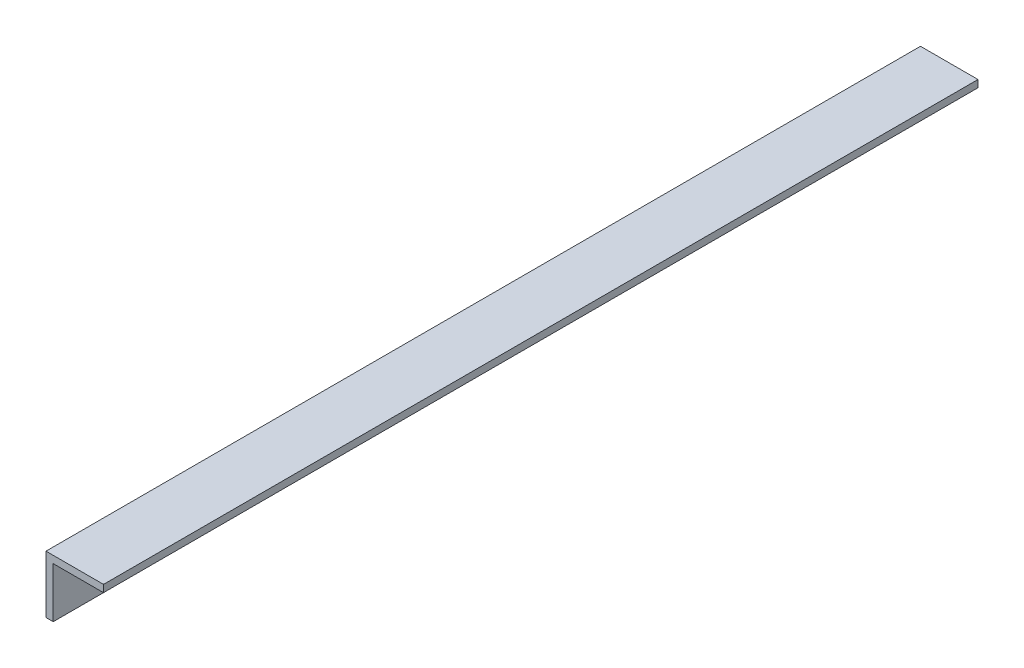
ISO-10303-21;
HEADER;
FILE_DESCRIPTION(('STEP AP214'),'2;1');
FILE_NAME('part.step','',(''),(''),'','','');
FILE_SCHEMA(('AUTOMOTIVE_DESIGN { 1 0 10303 214 1 1 1 1 }'));
ENDSEC;
DATA;
#1=APPLICATION_CONTEXT('core data for automotive mechanical design processes');
#2=APPLICATION_PROTOCOL_DEFINITION('international standard','automotive_design',2000,#1);
#3=PRODUCT_CONTEXT('',#1,'mechanical');
#4=PRODUCT('Part','Part','',(#3));
#5=PRODUCT_RELATED_PRODUCT_CATEGORY('part','',(#4));
#6=PRODUCT_DEFINITION_FORMATION('','',#4);
#7=PRODUCT_DEFINITION_CONTEXT('part definition',#1,'design');
#8=PRODUCT_DEFINITION('design','',#6,#7);
#9=PRODUCT_DEFINITION_SHAPE('','',#8);
#10=(LENGTH_UNIT() NAMED_UNIT(*) SI_UNIT(.MILLI.,.METRE.));
#11=(NAMED_UNIT(*) PLANE_ANGLE_UNIT() SI_UNIT($,.RADIAN.));
#12=(NAMED_UNIT(*) SI_UNIT($,.STERADIAN.) SOLID_ANGLE_UNIT());
#13=UNCERTAINTY_MEASURE_WITH_UNIT(LENGTH_MEASURE(1.E-05),#10,'distance_accuracy_value','');
#14=(GEOMETRIC_REPRESENTATION_CONTEXT(3) GLOBAL_UNCERTAINTY_ASSIGNED_CONTEXT((#13)) GLOBAL_UNIT_ASSIGNED_CONTEXT((#10,
#11,#12)) REPRESENTATION_CONTEXT('',''));
#15=CARTESIAN_POINT('',(0.,0.,0.));
#16=DIRECTION('',(0.,0.,1.));
#17=DIRECTION('',(1.,0.,0.));
#18=AXIS2_PLACEMENT_3D('',#15,#16,#17);
#19=CARTESIAN_POINT('',(3.175,0.,386.08));
#20=DIRECTION('',(0.,1.,0.));
#21=DIRECTION('',(-1.,0.,0.));
#22=AXIS2_PLACEMENT_3D('',#19,#20,#21);
#23=PLANE('',#22);
#24=DIRECTION('',(1.,0.,0.));
#25=VECTOR('',#24,1.);
#26=CARTESIAN_POINT('',(3.175,0.,0.));
#27=LINE('',#26,#25);
#28=CARTESIAN_POINT('',(0.,0.,0.));
#29=VERTEX_POINT('',#28);
#30=CARTESIAN_POINT('',(3.175,0.,0.));
#31=VERTEX_POINT('',#30);
#32=EDGE_CURVE('E119',#29,#31,#27,.T.);
#33=ORIENTED_EDGE('',*,*,#32,.T.);
#34=DIRECTION('',(0.,0.,-1.));
#35=VECTOR('',#34,1.);
#36=CARTESIAN_POINT('',(3.175,0.,386.08));
#37=LINE('',#36,#35);
#38=CARTESIAN_POINT('',(3.175,0.,386.08));
#39=VERTEX_POINT('',#38);
#40=EDGE_CURVE('E11',#39,#31,#37,.T.);
#41=ORIENTED_EDGE('',*,*,#40,.F.);
#42=DIRECTION('',(1.,0.,0.));
#43=VECTOR('',#42,1.);
#44=CARTESIAN_POINT('',(3.175,0.,386.08));
#45=LINE('',#44,#43);
#46=CARTESIAN_POINT('',(0.,0.,386.08));
#47=VERTEX_POINT('',#46);
#48=EDGE_CURVE('E130',#47,#39,#45,.T.);
#49=ORIENTED_EDGE('',*,*,#48,.F.);
#50=DIRECTION('',(0.,0.,-1.));
#51=VECTOR('',#50,1.);
#52=CARTESIAN_POINT('',(0.,0.,386.08));
#53=LINE('',#52,#51);
#54=EDGE_CURVE('E115',#47,#29,#53,.T.);
#55=ORIENTED_EDGE('',*,*,#54,.T.);
#56=EDGE_LOOP('',(#33,#41,#49,#55));
#57=FACE_BOUND('',#56,.T.);
#58=ADVANCED_FACE('F33',(#57),#23,.F.);
#59=CARTESIAN_POINT('',(3.175,22.225,386.08));
#60=DIRECTION('',(-1.,0.,0.));
#61=DIRECTION('',(0.,-1.,0.));
#62=AXIS2_PLACEMENT_3D('',#59,#60,#61);
#63=PLANE('',#62);
#64=CARTESIAN_POINT('',(3.175,12.7,158.75));
#65=DIRECTION('',(1.,0.,0.));
#66=DIRECTION('',(0.,1.,0.));
#67=AXIS2_PLACEMENT_3D('',#64,#65,#66);
#68=CIRCLE('',#67,3.96874999999999);
#69=CARTESIAN_POINT('',(3.175,16.66875,158.75));
#70=VERTEX_POINT('',#69);
#71=EDGE_CURVE('E144',#70,#70,#68,.T.);
#72=ORIENTED_EDGE('',*,*,#71,.F.);
#73=EDGE_LOOP('',(#72));
#74=FACE_BOUND('',#73,.T.);
#75=CARTESIAN_POINT('',(3.175,12.7,19.05));
#76=DIRECTION('',(1.,0.,0.));
#77=DIRECTION('',(0.,1.,0.));
#78=AXIS2_PLACEMENT_3D('',#75,#76,#77);
#79=CIRCLE('',#78,3.96875);
#80=CARTESIAN_POINT('',(3.175,16.66875,19.05));
#81=VERTEX_POINT('',#80);
#82=EDGE_CURVE('E136',#81,#81,#79,.T.);
#83=ORIENTED_EDGE('',*,*,#82,.F.);
#84=EDGE_LOOP('',(#83));
#85=FACE_BOUND('',#84,.T.);
#86=DIRECTION('',(0.,1.,0.));
#87=VECTOR('',#86,1.);
#88=CARTESIAN_POINT('',(3.175,22.225,0.));
#89=LINE('',#88,#87);
#90=CARTESIAN_POINT('',(3.175,22.225,0.));
#91=VERTEX_POINT('',#90);
#92=EDGE_CURVE('E122',#31,#91,#89,.T.);
#93=ORIENTED_EDGE('',*,*,#92,.T.);
#94=DIRECTION('',(0.,0.,-1.));
#95=VECTOR('',#94,1.);
#96=CARTESIAN_POINT('',(3.175,22.225,386.08));
#97=LINE('',#96,#95);
#98=CARTESIAN_POINT('',(3.175,22.225,386.08));
#99=VERTEX_POINT('',#98);
#100=EDGE_CURVE('E42',#99,#91,#97,.T.);
#101=ORIENTED_EDGE('',*,*,#100,.F.);
#102=DIRECTION('',(0.,1.,0.));
#103=VECTOR('',#102,1.);
#104=CARTESIAN_POINT('',(3.175,22.225,386.08));
#105=LINE('',#104,#103);
#106=EDGE_CURVE('E88',#39,#99,#105,.T.);
#107=ORIENTED_EDGE('',*,*,#106,.F.);
#108=ORIENTED_EDGE('',*,*,#40,.T.);
#109=EDGE_LOOP('',(#93,#101,#107,#108));
#110=FACE_BOUND('',#109,.T.);
#111=ADVANCED_FACE('F150',(#74,#85,#110),#63,.F.);
#112=CARTESIAN_POINT('',(25.4,22.225,386.08));
#113=DIRECTION('',(0.,1.,0.));
#114=DIRECTION('',(-1.,0.,0.));
#115=AXIS2_PLACEMENT_3D('',#112,#113,#114);
#116=PLANE('',#115);
#117=DIRECTION('',(1.,0.,0.));
#118=VECTOR('',#117,1.);
#119=CARTESIAN_POINT('',(25.4,22.225,0.));
#120=LINE('',#119,#118);
#121=CARTESIAN_POINT('',(25.4,22.225,0.));
#122=VERTEX_POINT('',#121);
#123=EDGE_CURVE('E125',#91,#122,#120,.T.);
#124=ORIENTED_EDGE('',*,*,#123,.T.);
#125=DIRECTION('',(0.,0.,-1.));
#126=VECTOR('',#125,1.);
#127=CARTESIAN_POINT('',(25.4,22.225,386.08));
#128=LINE('',#127,#126);
#129=CARTESIAN_POINT('',(25.4,22.225,386.08));
#130=VERTEX_POINT('',#129);
#131=EDGE_CURVE('E110',#130,#122,#128,.T.);
#132=ORIENTED_EDGE('',*,*,#131,.F.);
#133=DIRECTION('',(1.,0.,0.));
#134=VECTOR('',#133,1.);
#135=CARTESIAN_POINT('',(25.4,22.225,386.08));
#136=LINE('',#135,#134);
#137=EDGE_CURVE('E101',#99,#130,#136,.T.);
#138=ORIENTED_EDGE('',*,*,#137,.F.);
#139=ORIENTED_EDGE('',*,*,#100,.T.);
#140=EDGE_LOOP('',(#124,#132,#138,#139));
#141=FACE_BOUND('',#140,.T.);
#142=ADVANCED_FACE('F153',(#141),#116,.F.);
#143=CARTESIAN_POINT('',(25.4,25.4,386.08));
#144=DIRECTION('',(-1.,0.,0.));
#145=DIRECTION('',(0.,0.,1.));
#146=AXIS2_PLACEMENT_3D('',#143,#144,#145);
#147=PLANE('',#146);
#148=DIRECTION('',(0.,1.,0.));
#149=VECTOR('',#148,1.);
#150=CARTESIAN_POINT('',(25.4,25.4,0.));
#151=LINE('',#150,#149);
#152=CARTESIAN_POINT('',(25.4,25.4,0.));
#153=VERTEX_POINT('',#152);
#154=EDGE_CURVE('E109',#122,#153,#151,.T.);
#155=ORIENTED_EDGE('',*,*,#154,.T.);
#156=DIRECTION('',(0.,0.,-1.));
#157=VECTOR('',#156,1.);
#158=CARTESIAN_POINT('',(25.4,25.4,386.08));
#159=LINE('',#158,#157);
#160=CARTESIAN_POINT('',(25.4,25.4,386.08));
#161=VERTEX_POINT('',#160);
#162=EDGE_CURVE('E106',#161,#153,#159,.T.);
#163=ORIENTED_EDGE('',*,*,#162,.F.);
#164=DIRECTION('',(0.,1.,0.));
#165=VECTOR('',#164,1.);
#166=CARTESIAN_POINT('',(25.4,25.4,386.08));
#167=LINE('',#166,#165);
#168=EDGE_CURVE('E95',#130,#161,#167,.T.);
#169=ORIENTED_EDGE('',*,*,#168,.F.);
#170=ORIENTED_EDGE('',*,*,#131,.T.);
#171=EDGE_LOOP('',(#155,#163,#169,#170));
#172=FACE_BOUND('',#171,.T.);
#173=ADVANCED_FACE('F107',(#172),#147,.F.);
#174=CARTESIAN_POINT('',(0.,25.4,386.08));
#175=DIRECTION('',(0.,-1.,0.));
#176=DIRECTION('',(0.,0.,-1.));
#177=AXIS2_PLACEMENT_3D('',#174,#175,#176);
#178=PLANE('',#177);
#179=DIRECTION('',(-1.,0.,0.));
#180=VECTOR('',#179,1.);
#181=CARTESIAN_POINT('',(0.,25.4,0.));
#182=LINE('',#181,#180);
#183=CARTESIAN_POINT('',(0.,25.4,0.));
#184=VERTEX_POINT('',#183);
#185=EDGE_CURVE('E74',#153,#184,#182,.T.);
#186=ORIENTED_EDGE('',*,*,#185,.T.);
#187=DIRECTION('',(0.,0.,-1.));
#188=VECTOR('',#187,1.);
#189=CARTESIAN_POINT('',(0.,25.4,386.08));
#190=LINE('',#189,#188);
#191=CARTESIAN_POINT('',(0.,25.4,386.08));
#192=VERTEX_POINT('',#191);
#193=EDGE_CURVE('E111',#192,#184,#190,.T.);
#194=ORIENTED_EDGE('',*,*,#193,.F.);
#195=DIRECTION('',(-1.,0.,0.));
#196=VECTOR('',#195,1.);
#197=CARTESIAN_POINT('',(0.,25.4,386.08));
#198=LINE('',#197,#196);
#199=EDGE_CURVE('E99',#161,#192,#198,.T.);
#200=ORIENTED_EDGE('',*,*,#199,.F.);
#201=ORIENTED_EDGE('',*,*,#162,.T.);
#202=EDGE_LOOP('',(#186,#194,#200,#201));
#203=FACE_BOUND('',#202,.T.);
#204=ADVANCED_FACE('F113',(#203),#178,.F.);
#205=CARTESIAN_POINT('',(0.,0.,386.08));
#206=DIRECTION('',(1.,0.,0.));
#207=DIRECTION('',(0.,0.,-1.));
#208=AXIS2_PLACEMENT_3D('',#205,#206,#207);
#209=PLANE('',#208);
#210=CARTESIAN_POINT('',(0.,12.7,158.75));
#211=DIRECTION('',(1.,0.,0.));
#212=DIRECTION('',(0.,0.,-1.));
#213=AXIS2_PLACEMENT_3D('',#210,#211,#212);
#214=CIRCLE('',#213,3.96874999999999);
#215=CARTESIAN_POINT('',(0.,12.7,154.78125));
#216=VERTEX_POINT('',#215);
#217=EDGE_CURVE('E36',#216,#216,#214,.T.);
#218=ORIENTED_EDGE('',*,*,#217,.T.);
#219=EDGE_LOOP('',(#218));
#220=FACE_BOUND('',#219,.T.);
#221=CARTESIAN_POINT('',(0.,12.7,19.05));
#222=DIRECTION('',(1.,0.,0.));
#223=DIRECTION('',(0.,0.,-1.));
#224=AXIS2_PLACEMENT_3D('',#221,#222,#223);
#225=CIRCLE('',#224,3.96875);
#226=CARTESIAN_POINT('',(0.,12.7,15.08125));
#227=VERTEX_POINT('',#226);
#228=EDGE_CURVE('E123',#227,#227,#225,.T.);
#229=ORIENTED_EDGE('',*,*,#228,.T.);
#230=EDGE_LOOP('',(#229));
#231=FACE_BOUND('',#230,.T.);
#232=DIRECTION('',(0.,-1.,0.));
#233=VECTOR('',#232,1.);
#234=CARTESIAN_POINT('',(0.,0.,0.));
#235=LINE('',#234,#233);
#236=EDGE_CURVE('E80',#184,#29,#235,.T.);
#237=ORIENTED_EDGE('',*,*,#236,.T.);
#238=ORIENTED_EDGE('',*,*,#54,.F.);
#239=DIRECTION('',(0.,-1.,0.));
#240=VECTOR('',#239,1.);
#241=CARTESIAN_POINT('',(0.,0.,386.08));
#242=LINE('',#241,#240);
#243=EDGE_CURVE('E51',#192,#47,#242,.T.);
#244=ORIENTED_EDGE('',*,*,#243,.F.);
#245=ORIENTED_EDGE('',*,*,#193,.T.);
#246=EDGE_LOOP('',(#237,#238,#244,#245));
#247=FACE_BOUND('',#246,.T.);
#248=ADVANCED_FACE('F158',(#220,#231,#247),#209,.F.);
#249=CARTESIAN_POINT('',(0.,0.,386.08));
#250=DIRECTION('',(0.,0.,-1.));
#251=DIRECTION('',(-1.,0.,0.));
#252=AXIS2_PLACEMENT_3D('',#249,#250,#251);
#253=PLANE('',#252);
#254=ORIENTED_EDGE('',*,*,#48,.T.);
#255=ORIENTED_EDGE('',*,*,#106,.T.);
#256=ORIENTED_EDGE('',*,*,#137,.T.);
#257=ORIENTED_EDGE('',*,*,#168,.T.);
#258=ORIENTED_EDGE('',*,*,#199,.T.);
#259=ORIENTED_EDGE('',*,*,#243,.T.);
#260=EDGE_LOOP('',(#254,#255,#256,#257,#258,#259));
#261=FACE_BOUND('',#260,.T.);
#262=ADVANCED_FACE('F97',(#261),#253,.F.);
#263=CARTESIAN_POINT('',(0.,0.,0.));
#264=DIRECTION('',(0.,0.,-1.));
#265=DIRECTION('',(-1.,0.,0.));
#266=AXIS2_PLACEMENT_3D('',#263,#264,#265);
#267=PLANE('',#266);
#268=ORIENTED_EDGE('',*,*,#32,.F.);
#269=ORIENTED_EDGE('',*,*,#236,.F.);
#270=ORIENTED_EDGE('',*,*,#185,.F.);
#271=ORIENTED_EDGE('',*,*,#154,.F.);
#272=ORIENTED_EDGE('',*,*,#123,.F.);
#273=ORIENTED_EDGE('',*,*,#92,.F.);
#274=EDGE_LOOP('',(#268,#269,#270,#271,#272,#273));
#275=FACE_BOUND('',#274,.T.);
#276=ADVANCED_FACE('F156',(#275),#267,.T.);
#277=CARTESIAN_POINT('',(-3.175,12.7,19.05));
#278=DIRECTION('',(1.,0.,0.));
#279=DIRECTION('',(0.,1.,0.));
#280=AXIS2_PLACEMENT_3D('',#277,#278,#279);
#281=CYLINDRICAL_SURFACE('',#280,3.96875);
#282=ORIENTED_EDGE('',*,*,#82,.T.);
#283=EDGE_LOOP('',(#282));
#284=FACE_BOUND('',#283,.T.);
#285=ORIENTED_EDGE('',*,*,#228,.F.);
#286=EDGE_LOOP('',(#285));
#287=FACE_BOUND('',#286,.T.);
#288=ADVANCED_FACE('F205',(#284,#287),#281,.F.);
#289=CARTESIAN_POINT('',(-3.175,12.7,158.75));
#290=DIRECTION('',(1.,0.,0.));
#291=DIRECTION('',(0.,1.,0.));
#292=AXIS2_PLACEMENT_3D('',#289,#290,#291);
#293=CYLINDRICAL_SURFACE('',#292,3.96874999999999);
#294=ORIENTED_EDGE('',*,*,#71,.T.);
#295=EDGE_LOOP('',(#294));
#296=FACE_BOUND('',#295,.T.);
#297=ORIENTED_EDGE('',*,*,#217,.F.);
#298=EDGE_LOOP('',(#297));
#299=FACE_BOUND('',#298,.T.);
#300=ADVANCED_FACE('F223',(#296,#299),#293,.F.);
#301=CLOSED_SHELL('',(#58,#111,#142,#173,#204,#248,#262,#276,#288,#300));
#302=MANIFOLD_SOLID_BREP('B2',#301);
#303=ADVANCED_BREP_SHAPE_REPRESENTATION('',(#18,#302),#14);
#304=SHAPE_DEFINITION_REPRESENTATION(#9,#303);
ENDSEC;
END-ISO-10303-21;
